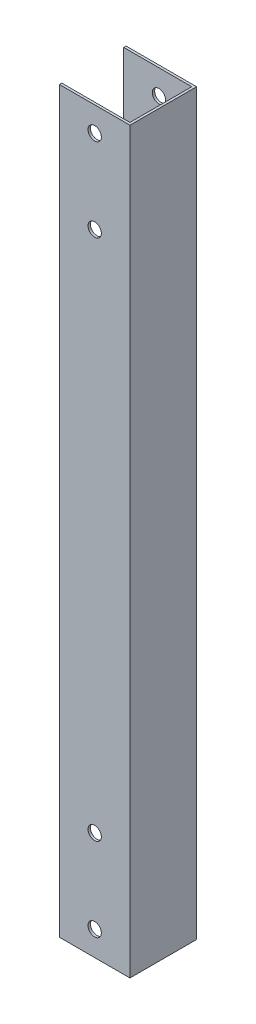
ISO-10303-21;
HEADER;
FILE_DESCRIPTION(('STEP AP214'),'2;1');
FILE_NAME('part.step','',(''),(''),'','','');
FILE_SCHEMA(('AUTOMOTIVE_DESIGN { 1 0 10303 214 1 1 1 1 }'));
ENDSEC;
DATA;
#1=APPLICATION_CONTEXT('core data for automotive mechanical design processes');
#2=APPLICATION_PROTOCOL_DEFINITION('international standard','automotive_design',2000,#1);
#3=PRODUCT_CONTEXT('',#1,'mechanical');
#4=PRODUCT('Part','Part','',(#3));
#5=PRODUCT_RELATED_PRODUCT_CATEGORY('part','',(#4));
#6=PRODUCT_DEFINITION_FORMATION('','',#4);
#7=PRODUCT_DEFINITION_CONTEXT('part definition',#1,'design');
#8=PRODUCT_DEFINITION('design','',#6,#7);
#9=PRODUCT_DEFINITION_SHAPE('','',#8);
#10=(LENGTH_UNIT() NAMED_UNIT(*) SI_UNIT(.MILLI.,.METRE.));
#11=(NAMED_UNIT(*) PLANE_ANGLE_UNIT() SI_UNIT($,.RADIAN.));
#12=(NAMED_UNIT(*) SI_UNIT($,.STERADIAN.) SOLID_ANGLE_UNIT());
#13=UNCERTAINTY_MEASURE_WITH_UNIT(LENGTH_MEASURE(1.E-05),#10,'distance_accuracy_value','');
#14=(GEOMETRIC_REPRESENTATION_CONTEXT(3) GLOBAL_UNCERTAINTY_ASSIGNED_CONTEXT((#13)) GLOBAL_UNIT_ASSIGNED_CONTEXT((#10,
#11,#12)) REPRESENTATION_CONTEXT('',''));
#15=CARTESIAN_POINT('',(0.,0.,0.));
#16=DIRECTION('',(0.,0.,1.));
#17=DIRECTION('',(1.,0.,0.));
#18=AXIS2_PLACEMENT_3D('',#15,#16,#17);
#19=CARTESIAN_POINT('',(-12.7,-133.,-12.));
#20=DIRECTION('',(-1.,0.,0.));
#21=DIRECTION('',(0.,0.,1.));
#22=AXIS2_PLACEMENT_3D('',#19,#20,#21);
#23=PLANE('',#22);
#24=DIRECTION('',(0.,0.,1.));
#25=VECTOR('',#24,1.);
#26=CARTESIAN_POINT('',(-12.7,133.,-12.));
#27=LINE('',#26,#25);
#28=CARTESIAN_POINT('',(-12.7,133.,11.14));
#29=VERTEX_POINT('',#28);
#30=CARTESIAN_POINT('',(-12.7,133.,12.));
#31=VERTEX_POINT('',#30);
#32=EDGE_CURVE('E135',#29,#31,#27,.T.);
#33=ORIENTED_EDGE('',*,*,#32,.F.);
#34=DIRECTION('',(0.,-1.,0.));
#35=VECTOR('',#34,1.);
#36=CARTESIAN_POINT('',(-12.7,-133.,11.14));
#37=LINE('',#36,#35);
#38=CARTESIAN_POINT('',(-12.7,-133.,11.14));
#39=VERTEX_POINT('',#38);
#40=EDGE_CURVE('E122',#29,#39,#37,.T.);
#41=ORIENTED_EDGE('',*,*,#40,.T.);
#42=DIRECTION('',(0.,0.,1.));
#43=VECTOR('',#42,1.);
#44=CARTESIAN_POINT('',(-12.7,-133.,-12.));
#45=LINE('',#44,#43);
#46=CARTESIAN_POINT('',(-12.7,-133.,12.));
#47=VERTEX_POINT('',#46);
#48=EDGE_CURVE('E147',#39,#47,#45,.T.);
#49=ORIENTED_EDGE('',*,*,#48,.T.);
#50=DIRECTION('',(0.,1.,0.));
#51=VECTOR('',#50,1.);
#52=CARTESIAN_POINT('',(-12.7,-133.,12.));
#53=LINE('',#52,#51);
#54=EDGE_CURVE('E156',#47,#31,#53,.T.);
#55=ORIENTED_EDGE('',*,*,#54,.T.);
#56=EDGE_LOOP('',(#33,#41,#49,#55));
#57=FACE_BOUND('',#56,.T.);
#58=ADVANCED_FACE('F33',(#57),#23,.T.);
#59=CARTESIAN_POINT('',(-12.7,-133.,-12.));
#60=VERTEX_POINT('',#59);
#61=CARTESIAN_POINT('',(-12.7,-133.,-11.14));
#62=VERTEX_POINT('',#61);
#63=EDGE_CURVE('E148',#60,#62,#45,.T.);
#64=ORIENTED_EDGE('',*,*,#63,.T.);
#65=DIRECTION('',(0.,1.,0.));
#66=VECTOR('',#65,1.);
#67=CARTESIAN_POINT('',(-12.7,-133.,-11.14));
#68=LINE('',#67,#66);
#69=CARTESIAN_POINT('',(-12.7,133.,-11.14));
#70=VERTEX_POINT('',#69);
#71=EDGE_CURVE('E102',#62,#70,#68,.T.);
#72=ORIENTED_EDGE('',*,*,#71,.T.);
#73=CARTESIAN_POINT('',(-12.7,133.,-12.));
#74=VERTEX_POINT('',#73);
#75=EDGE_CURVE('E136',#74,#70,#27,.T.);
#76=ORIENTED_EDGE('',*,*,#75,.F.);
#77=DIRECTION('',(0.,1.,0.));
#78=VECTOR('',#77,1.);
#79=CARTESIAN_POINT('',(-12.7,-133.,-12.));
#80=LINE('',#79,#78);
#81=EDGE_CURVE('E159',#60,#74,#80,.T.);
#82=ORIENTED_EDGE('',*,*,#81,.F.);
#83=EDGE_LOOP('',(#64,#72,#76,#82));
#84=FACE_BOUND('',#83,.T.);
#85=ADVANCED_FACE('F205',(#84),#23,.T.);
#86=CARTESIAN_POINT('',(0.,-133.,0.));
#87=DIRECTION('',(0.,1.,0.));
#88=DIRECTION('',(0.,0.,1.));
#89=AXIS2_PLACEMENT_3D('',#86,#87,#88);
#90=PLANE('',#89);
#91=DIRECTION('',(-1.,0.,0.));
#92=VECTOR('',#91,1.);
#93=CARTESIAN_POINT('',(0.,-133.,11.14));
#94=LINE('',#93,#92);
#95=CARTESIAN_POINT('',(11.84,-133.,11.14));
#96=VERTEX_POINT('',#95);
#97=EDGE_CURVE('E121',#96,#39,#94,.T.);
#98=ORIENTED_EDGE('',*,*,#97,.F.);
#99=DIRECTION('',(0.,0.,1.));
#100=VECTOR('',#99,1.);
#101=CARTESIAN_POINT('',(11.84,-133.,0.));
#102=LINE('',#101,#100);
#103=CARTESIAN_POINT('',(11.84,-133.,-11.14));
#104=VERTEX_POINT('',#103);
#105=EDGE_CURVE('E107',#104,#96,#102,.T.);
#106=ORIENTED_EDGE('',*,*,#105,.F.);
#107=DIRECTION('',(1.,0.,0.));
#108=VECTOR('',#107,1.);
#109=CARTESIAN_POINT('',(0.,-133.,-11.14));
#110=LINE('',#109,#108);
#111=EDGE_CURVE('E99',#62,#104,#110,.T.);
#112=ORIENTED_EDGE('',*,*,#111,.F.);
#113=ORIENTED_EDGE('',*,*,#63,.F.);
#114=DIRECTION('',(-1.,0.,0.));
#115=VECTOR('',#114,1.);
#116=CARTESIAN_POINT('',(-12.7,-133.,-12.));
#117=LINE('',#116,#115);
#118=CARTESIAN_POINT('',(12.7,-133.,-12.));
#119=VERTEX_POINT('',#118);
#120=EDGE_CURVE('E144',#119,#60,#117,.T.);
#121=ORIENTED_EDGE('',*,*,#120,.F.);
#122=DIRECTION('',(0.,0.,-1.));
#123=VECTOR('',#122,1.);
#124=CARTESIAN_POINT('',(12.7,-133.,-12.));
#125=LINE('',#124,#123);
#126=CARTESIAN_POINT('',(12.7,-133.,12.));
#127=VERTEX_POINT('',#126);
#128=EDGE_CURVE('E142',#127,#119,#125,.T.);
#129=ORIENTED_EDGE('',*,*,#128,.F.);
#130=DIRECTION('',(1.,0.,0.));
#131=VECTOR('',#130,1.);
#132=CARTESIAN_POINT('',(-12.7,-133.,12.));
#133=LINE('',#132,#131);
#134=EDGE_CURVE('E150',#47,#127,#133,.T.);
#135=ORIENTED_EDGE('',*,*,#134,.F.);
#136=ORIENTED_EDGE('',*,*,#48,.F.);
#137=EDGE_LOOP('',(#98,#106,#112,#113,#121,#129,#135,#136));
#138=FACE_BOUND('',#137,.T.);
#139=ADVANCED_FACE('F119',(#138),#90,.F.);
#140=CARTESIAN_POINT('',(0.,133.,0.));
#141=DIRECTION('',(0.,1.,0.));
#142=DIRECTION('',(0.,0.,1.));
#143=AXIS2_PLACEMENT_3D('',#140,#141,#142);
#144=PLANE('',#143);
#145=DIRECTION('',(0.,0.,1.));
#146=VECTOR('',#145,1.);
#147=CARTESIAN_POINT('',(11.84,133.,0.));
#148=LINE('',#147,#146);
#149=CARTESIAN_POINT('',(11.84,133.,-11.14));
#150=VERTEX_POINT('',#149);
#151=CARTESIAN_POINT('',(11.84,133.,11.14));
#152=VERTEX_POINT('',#151);
#153=EDGE_CURVE('E42',#150,#152,#148,.T.);
#154=ORIENTED_EDGE('',*,*,#153,.T.);
#155=DIRECTION('',(-1.,0.,0.));
#156=VECTOR('',#155,1.);
#157=CARTESIAN_POINT('',(0.,133.,11.14));
#158=LINE('',#157,#156);
#159=EDGE_CURVE('E11',#152,#29,#158,.T.);
#160=ORIENTED_EDGE('',*,*,#159,.T.);
#161=ORIENTED_EDGE('',*,*,#32,.T.);
#162=DIRECTION('',(1.,0.,0.));
#163=VECTOR('',#162,1.);
#164=CARTESIAN_POINT('',(-12.7,133.,12.));
#165=LINE('',#164,#163);
#166=CARTESIAN_POINT('',(12.7,133.,12.));
#167=VERTEX_POINT('',#166);
#168=EDGE_CURVE('E139',#31,#167,#165,.T.);
#169=ORIENTED_EDGE('',*,*,#168,.T.);
#170=DIRECTION('',(0.,0.,-1.));
#171=VECTOR('',#170,1.);
#172=CARTESIAN_POINT('',(12.7,133.,-12.));
#173=LINE('',#172,#171);
#174=CARTESIAN_POINT('',(12.7,133.,-12.));
#175=VERTEX_POINT('',#174);
#176=EDGE_CURVE('E129',#167,#175,#173,.T.);
#177=ORIENTED_EDGE('',*,*,#176,.T.);
#178=DIRECTION('',(-1.,0.,0.));
#179=VECTOR('',#178,1.);
#180=CARTESIAN_POINT('',(-12.7,133.,-12.));
#181=LINE('',#180,#179);
#182=EDGE_CURVE('E132',#175,#74,#181,.T.);
#183=ORIENTED_EDGE('',*,*,#182,.T.);
#184=ORIENTED_EDGE('',*,*,#75,.T.);
#185=DIRECTION('',(1.,0.,0.));
#186=VECTOR('',#185,1.);
#187=CARTESIAN_POINT('',(0.,133.,-11.14));
#188=LINE('',#187,#186);
#189=EDGE_CURVE('E155',#70,#150,#188,.T.);
#190=ORIENTED_EDGE('',*,*,#189,.T.);
#191=EDGE_LOOP('',(#154,#160,#161,#169,#177,#183,#184,#190));
#192=FACE_BOUND('',#191,.T.);
#193=ADVANCED_FACE('F207',(#192),#144,.T.);
#194=CARTESIAN_POINT('',(12.7,-133.,-12.));
#195=DIRECTION('',(1.,0.,0.));
#196=DIRECTION('',(0.,0.,-1.));
#197=AXIS2_PLACEMENT_3D('',#194,#195,#196);
#198=PLANE('',#197);
#199=DIRECTION('',(0.,1.,0.));
#200=VECTOR('',#199,1.);
#201=CARTESIAN_POINT('',(12.7,-133.,-12.));
#202=LINE('',#201,#200);
#203=EDGE_CURVE('E153',#119,#175,#202,.T.);
#204=ORIENTED_EDGE('',*,*,#203,.T.);
#205=ORIENTED_EDGE('',*,*,#176,.F.);
#206=DIRECTION('',(0.,1.,0.));
#207=VECTOR('',#206,1.);
#208=CARTESIAN_POINT('',(12.7,-133.,12.));
#209=LINE('',#208,#207);
#210=EDGE_CURVE('E58',#127,#167,#209,.T.);
#211=ORIENTED_EDGE('',*,*,#210,.F.);
#212=ORIENTED_EDGE('',*,*,#128,.T.);
#213=EDGE_LOOP('',(#204,#205,#211,#212));
#214=FACE_BOUND('',#213,.T.);
#215=ADVANCED_FACE('F35',(#214),#198,.T.);
#216=CARTESIAN_POINT('',(-12.7,-133.,12.));
#217=DIRECTION('',(0.,0.,1.));
#218=DIRECTION('',(1.,0.,0.));
#219=AXIS2_PLACEMENT_3D('',#216,#217,#218);
#220=PLANE('',#219);
#221=CARTESIAN_POINT('',(0.,124.125,12.));
#222=DIRECTION('',(0.,0.,1.));
#223=DIRECTION('',(1.,0.,0.));
#224=AXIS2_PLACEMENT_3D('',#221,#222,#223);
#225=CIRCLE('',#224,2.4);
#226=CARTESIAN_POINT('',(2.40000000000003,124.125,12.));
#227=VERTEX_POINT('',#226);
#228=EDGE_CURVE('E116',#227,#227,#225,.F.);
#229=ORIENTED_EDGE('',*,*,#228,.T.);
#230=EDGE_LOOP('',(#229));
#231=FACE_BOUND('',#230,.T.);
#232=CARTESIAN_POINT('',(0.,-94.125,12.));
#233=DIRECTION('',(0.,0.,1.));
#234=DIRECTION('',(1.,0.,0.));
#235=AXIS2_PLACEMENT_3D('',#232,#233,#234);
#236=CIRCLE('',#235,2.4);
#237=CARTESIAN_POINT('',(2.40000000000003,-94.125,12.));
#238=VERTEX_POINT('',#237);
#239=EDGE_CURVE('E192',#238,#238,#236,.F.);
#240=ORIENTED_EDGE('',*,*,#239,.T.);
#241=EDGE_LOOP('',(#240));
#242=FACE_BOUND('',#241,.T.);
#243=CARTESIAN_POINT('',(0.,-124.125,12.));
#244=DIRECTION('',(0.,0.,1.));
#245=DIRECTION('',(1.,0.,0.));
#246=AXIS2_PLACEMENT_3D('',#243,#244,#245);
#247=CIRCLE('',#246,2.4);
#248=CARTESIAN_POINT('',(2.40000000000003,-124.125,12.));
#249=VERTEX_POINT('',#248);
#250=EDGE_CURVE('E175',#249,#249,#247,.F.);
#251=ORIENTED_EDGE('',*,*,#250,.T.);
#252=EDGE_LOOP('',(#251));
#253=FACE_BOUND('',#252,.T.);
#254=CARTESIAN_POINT('',(0.,94.125,12.));
#255=DIRECTION('',(0.,0.,1.));
#256=DIRECTION('',(1.,0.,0.));
#257=AXIS2_PLACEMENT_3D('',#254,#255,#256);
#258=CIRCLE('',#257,2.4);
#259=CARTESIAN_POINT('',(2.4,94.125,12.));
#260=VERTEX_POINT('',#259);
#261=EDGE_CURVE('E171',#260,#260,#258,.F.);
#262=ORIENTED_EDGE('',*,*,#261,.T.);
#263=EDGE_LOOP('',(#262));
#264=FACE_BOUND('',#263,.T.);
#265=ORIENTED_EDGE('',*,*,#210,.T.);
#266=ORIENTED_EDGE('',*,*,#168,.F.);
#267=ORIENTED_EDGE('',*,*,#54,.F.);
#268=ORIENTED_EDGE('',*,*,#134,.T.);
#269=EDGE_LOOP('',(#265,#266,#267,#268));
#270=FACE_BOUND('',#269,.T.);
#271=ADVANCED_FACE('F214',(#231,#242,#253,#264,#270),#220,.T.);
#272=CARTESIAN_POINT('',(-12.7,-133.,-12.));
#273=DIRECTION('',(0.,0.,-1.));
#274=DIRECTION('',(-1.,0.,0.));
#275=AXIS2_PLACEMENT_3D('',#272,#273,#274);
#276=PLANE('',#275);
#277=CARTESIAN_POINT('',(0.,124.125,-12.));
#278=DIRECTION('',(0.,0.,-1.));
#279=DIRECTION('',(-1.,0.,0.));
#280=AXIS2_PLACEMENT_3D('',#277,#278,#279);
#281=CIRCLE('',#280,2.4);
#282=CARTESIAN_POINT('',(-2.39999999999997,124.125,-12.));
#283=VERTEX_POINT('',#282);
#284=EDGE_CURVE('E198',#283,#283,#281,.F.);
#285=ORIENTED_EDGE('',*,*,#284,.T.);
#286=EDGE_LOOP('',(#285));
#287=FACE_BOUND('',#286,.T.);
#288=CARTESIAN_POINT('',(0.,-94.125,-12.));
#289=DIRECTION('',(0.,0.,-1.));
#290=DIRECTION('',(-1.,0.,0.));
#291=AXIS2_PLACEMENT_3D('',#288,#289,#290);
#292=CIRCLE('',#291,2.4);
#293=CARTESIAN_POINT('',(-2.39999999999997,-94.125,-12.));
#294=VERTEX_POINT('',#293);
#295=EDGE_CURVE('E179',#294,#294,#292,.F.);
#296=ORIENTED_EDGE('',*,*,#295,.T.);
#297=EDGE_LOOP('',(#296));
#298=FACE_BOUND('',#297,.T.);
#299=CARTESIAN_POINT('',(0.,-124.125,-12.));
#300=DIRECTION('',(0.,0.,-1.));
#301=DIRECTION('',(-1.,0.,0.));
#302=AXIS2_PLACEMENT_3D('',#299,#300,#301);
#303=CIRCLE('',#302,2.4);
#304=CARTESIAN_POINT('',(-2.39999999999997,-124.125,-12.));
#305=VERTEX_POINT('',#304);
#306=EDGE_CURVE('E182',#305,#305,#303,.F.);
#307=ORIENTED_EDGE('',*,*,#306,.T.);
#308=EDGE_LOOP('',(#307));
#309=FACE_BOUND('',#308,.T.);
#310=CARTESIAN_POINT('',(0.,94.125,-12.));
#311=DIRECTION('',(0.,0.,-1.));
#312=DIRECTION('',(-1.,0.,0.));
#313=AXIS2_PLACEMENT_3D('',#310,#311,#312);
#314=CIRCLE('',#313,2.4);
#315=CARTESIAN_POINT('',(-2.4,94.125,-12.));
#316=VERTEX_POINT('',#315);
#317=EDGE_CURVE('E246',#316,#316,#314,.F.);
#318=ORIENTED_EDGE('',*,*,#317,.T.);
#319=EDGE_LOOP('',(#318));
#320=FACE_BOUND('',#319,.T.);
#321=ORIENTED_EDGE('',*,*,#81,.T.);
#322=ORIENTED_EDGE('',*,*,#182,.F.);
#323=ORIENTED_EDGE('',*,*,#203,.F.);
#324=ORIENTED_EDGE('',*,*,#120,.T.);
#325=EDGE_LOOP('',(#321,#322,#323,#324));
#326=FACE_BOUND('',#325,.T.);
#327=ADVANCED_FACE('F210',(#287,#298,#309,#320,#326),#276,.T.);
#328=CARTESIAN_POINT('',(11.84,150.,11.14));
#329=DIRECTION('',(0.,0.,-1.));
#330=DIRECTION('',(-1.,0.,0.));
#331=AXIS2_PLACEMENT_3D('',#328,#329,#330);
#332=PLANE('',#331);
#333=CARTESIAN_POINT('',(0.,124.125,11.14));
#334=DIRECTION('',(0.,0.,-1.));
#335=DIRECTION('',(-1.,0.,0.));
#336=AXIS2_PLACEMENT_3D('',#333,#334,#335);
#337=CIRCLE('',#336,2.4);
#338=CARTESIAN_POINT('',(-2.39999999999997,124.125,11.14));
#339=VERTEX_POINT('',#338);
#340=EDGE_CURVE('E195',#339,#339,#337,.F.);
#341=ORIENTED_EDGE('',*,*,#340,.T.);
#342=EDGE_LOOP('',(#341));
#343=FACE_BOUND('',#342,.T.);
#344=CARTESIAN_POINT('',(0.,-94.125,11.14));
#345=DIRECTION('',(0.,0.,-1.));
#346=DIRECTION('',(-1.,0.,0.));
#347=AXIS2_PLACEMENT_3D('',#344,#345,#346);
#348=CIRCLE('',#347,2.4);
#349=CARTESIAN_POINT('',(-2.39999999999997,-94.125,11.14));
#350=VERTEX_POINT('',#349);
#351=EDGE_CURVE('E174',#350,#350,#348,.F.);
#352=ORIENTED_EDGE('',*,*,#351,.T.);
#353=EDGE_LOOP('',(#352));
#354=FACE_BOUND('',#353,.T.);
#355=CARTESIAN_POINT('',(0.,-124.125,11.14));
#356=DIRECTION('',(0.,0.,-1.));
#357=DIRECTION('',(-1.,0.,0.));
#358=AXIS2_PLACEMENT_3D('',#355,#356,#357);
#359=CIRCLE('',#358,2.4);
#360=CARTESIAN_POINT('',(-2.39999999999997,-124.125,11.14));
#361=VERTEX_POINT('',#360);
#362=EDGE_CURVE('E170',#361,#361,#359,.F.);
#363=ORIENTED_EDGE('',*,*,#362,.T.);
#364=EDGE_LOOP('',(#363));
#365=FACE_BOUND('',#364,.T.);
#366=CARTESIAN_POINT('',(0.,94.125,11.14));
#367=DIRECTION('',(0.,0.,-1.));
#368=DIRECTION('',(-1.,0.,0.));
#369=AXIS2_PLACEMENT_3D('',#366,#367,#368);
#370=CIRCLE('',#369,2.4);
#371=CARTESIAN_POINT('',(-2.4,94.125,11.14));
#372=VERTEX_POINT('',#371);
#373=EDGE_CURVE('E167',#372,#372,#370,.F.);
#374=ORIENTED_EDGE('',*,*,#373,.T.);
#375=EDGE_LOOP('',(#374));
#376=FACE_BOUND('',#375,.T.);
#377=ORIENTED_EDGE('',*,*,#97,.T.);
#378=ORIENTED_EDGE('',*,*,#40,.F.);
#379=ORIENTED_EDGE('',*,*,#159,.F.);
#380=DIRECTION('',(0.,-1.,0.));
#381=VECTOR('',#380,1.);
#382=CARTESIAN_POINT('',(11.84,150.,11.14));
#383=LINE('',#382,#381);
#384=EDGE_CURVE('E115',#152,#96,#383,.T.);
#385=ORIENTED_EDGE('',*,*,#384,.T.);
#386=EDGE_LOOP('',(#377,#378,#379,#385));
#387=FACE_BOUND('',#386,.T.);
#388=ADVANCED_FACE('F231',(#343,#354,#365,#376,#387),#332,.T.);
#389=CARTESIAN_POINT('',(11.84,150.,-11.14));
#390=DIRECTION('',(-1.,0.,0.));
#391=DIRECTION('',(0.,0.,1.));
#392=AXIS2_PLACEMENT_3D('',#389,#390,#391);
#393=PLANE('',#392);
#394=ORIENTED_EDGE('',*,*,#105,.T.);
#395=ORIENTED_EDGE('',*,*,#384,.F.);
#396=ORIENTED_EDGE('',*,*,#153,.F.);
#397=DIRECTION('',(0.,-1.,0.));
#398=VECTOR('',#397,1.);
#399=CARTESIAN_POINT('',(11.84,150.,-11.14));
#400=LINE('',#399,#398);
#401=EDGE_CURVE('E50',#150,#104,#400,.T.);
#402=ORIENTED_EDGE('',*,*,#401,.T.);
#403=EDGE_LOOP('',(#394,#395,#396,#402));
#404=FACE_BOUND('',#403,.T.);
#405=ADVANCED_FACE('F110',(#404),#393,.T.);
#406=CARTESIAN_POINT('',(-14.16,150.,-11.14));
#407=DIRECTION('',(0.,0.,1.));
#408=DIRECTION('',(1.,0.,0.));
#409=AXIS2_PLACEMENT_3D('',#406,#407,#408);
#410=PLANE('',#409);
#411=CARTESIAN_POINT('',(0.,124.125,-11.14));
#412=DIRECTION('',(0.,0.,1.));
#413=DIRECTION('',(1.,0.,0.));
#414=AXIS2_PLACEMENT_3D('',#411,#412,#413);
#415=CIRCLE('',#414,2.4);
#416=CARTESIAN_POINT('',(2.40000000000003,124.125,-11.14));
#417=VERTEX_POINT('',#416);
#418=EDGE_CURVE('E37',#417,#417,#415,.F.);
#419=ORIENTED_EDGE('',*,*,#418,.T.);
#420=EDGE_LOOP('',(#419));
#421=FACE_BOUND('',#420,.T.);
#422=CARTESIAN_POINT('',(0.,-94.125,-11.14));
#423=DIRECTION('',(0.,0.,1.));
#424=DIRECTION('',(1.,0.,0.));
#425=AXIS2_PLACEMENT_3D('',#422,#423,#424);
#426=CIRCLE('',#425,2.4);
#427=CARTESIAN_POINT('',(2.40000000000003,-94.125,-11.14));
#428=VERTEX_POINT('',#427);
#429=EDGE_CURVE('E172',#428,#428,#426,.F.);
#430=ORIENTED_EDGE('',*,*,#429,.T.);
#431=EDGE_LOOP('',(#430));
#432=FACE_BOUND('',#431,.T.);
#433=CARTESIAN_POINT('',(0.,-124.125,-11.14));
#434=DIRECTION('',(0.,0.,1.));
#435=DIRECTION('',(1.,0.,0.));
#436=AXIS2_PLACEMENT_3D('',#433,#434,#435);
#437=CIRCLE('',#436,2.4);
#438=CARTESIAN_POINT('',(2.40000000000003,-124.125,-11.14));
#439=VERTEX_POINT('',#438);
#440=EDGE_CURVE('E168',#439,#439,#437,.F.);
#441=ORIENTED_EDGE('',*,*,#440,.T.);
#442=EDGE_LOOP('',(#441));
#443=FACE_BOUND('',#442,.T.);
#444=CARTESIAN_POINT('',(0.,94.125,-11.14));
#445=DIRECTION('',(0.,0.,1.));
#446=DIRECTION('',(1.,0.,0.));
#447=AXIS2_PLACEMENT_3D('',#444,#445,#446);
#448=CIRCLE('',#447,2.4);
#449=CARTESIAN_POINT('',(2.4,94.125,-11.14));
#450=VERTEX_POINT('',#449);
#451=EDGE_CURVE('E164',#450,#450,#448,.F.);
#452=ORIENTED_EDGE('',*,*,#451,.T.);
#453=EDGE_LOOP('',(#452));
#454=FACE_BOUND('',#453,.T.);
#455=ORIENTED_EDGE('',*,*,#111,.T.);
#456=ORIENTED_EDGE('',*,*,#401,.F.);
#457=ORIENTED_EDGE('',*,*,#189,.F.);
#458=ORIENTED_EDGE('',*,*,#71,.F.);
#459=EDGE_LOOP('',(#455,#456,#457,#458));
#460=FACE_BOUND('',#459,.T.);
#461=ADVANCED_FACE('F100',(#421,#432,#443,#454,#460),#410,.T.);
#462=CARTESIAN_POINT('',(0.,94.125,150.));
#463=DIRECTION('',(0.,0.,-1.));
#464=DIRECTION('',(-1.,0.,0.));
#465=AXIS2_PLACEMENT_3D('',#462,#463,#464);
#466=CYLINDRICAL_SURFACE('',#465,2.4);
#467=ORIENTED_EDGE('',*,*,#317,.F.);
#468=EDGE_LOOP('',(#467));
#469=FACE_BOUND('',#468,.T.);
#470=ORIENTED_EDGE('',*,*,#451,.F.);
#471=EDGE_LOOP('',(#470));
#472=FACE_BOUND('',#471,.T.);
#473=ADVANCED_FACE('F276',(#469,#472),#466,.F.);
#474=CARTESIAN_POINT('',(0.,-124.125,150.));
#475=DIRECTION('',(0.,0.,-1.));
#476=DIRECTION('',(-1.,0.,0.));
#477=AXIS2_PLACEMENT_3D('',#474,#475,#476);
#478=CYLINDRICAL_SURFACE('',#477,2.4);
#479=ORIENTED_EDGE('',*,*,#306,.F.);
#480=EDGE_LOOP('',(#479));
#481=FACE_BOUND('',#480,.T.);
#482=ORIENTED_EDGE('',*,*,#440,.F.);
#483=EDGE_LOOP('',(#482));
#484=FACE_BOUND('',#483,.T.);
#485=ADVANCED_FACE('F264',(#481,#484),#478,.F.);
#486=CARTESIAN_POINT('',(0.,-94.125,150.));
#487=DIRECTION('',(0.,0.,-1.));
#488=DIRECTION('',(-1.,0.,0.));
#489=AXIS2_PLACEMENT_3D('',#486,#487,#488);
#490=CYLINDRICAL_SURFACE('',#489,2.4);
#491=ORIENTED_EDGE('',*,*,#295,.F.);
#492=EDGE_LOOP('',(#491));
#493=FACE_BOUND('',#492,.T.);
#494=ORIENTED_EDGE('',*,*,#429,.F.);
#495=EDGE_LOOP('',(#494));
#496=FACE_BOUND('',#495,.T.);
#497=ADVANCED_FACE('F272',(#493,#496),#490,.F.);
#498=CARTESIAN_POINT('',(0.,124.125,150.));
#499=DIRECTION('',(0.,0.,-1.));
#500=DIRECTION('',(-1.,0.,0.));
#501=AXIS2_PLACEMENT_3D('',#498,#499,#500);
#502=CYLINDRICAL_SURFACE('',#501,2.4);
#503=ORIENTED_EDGE('',*,*,#284,.F.);
#504=EDGE_LOOP('',(#503));
#505=FACE_BOUND('',#504,.T.);
#506=ORIENTED_EDGE('',*,*,#418,.F.);
#507=EDGE_LOOP('',(#506));
#508=FACE_BOUND('',#507,.T.);
#509=ADVANCED_FACE('F273',(#505,#508),#502,.F.);
#510=ORIENTED_EDGE('',*,*,#261,.F.);
#511=EDGE_LOOP('',(#510));
#512=FACE_BOUND('',#511,.T.);
#513=ORIENTED_EDGE('',*,*,#373,.F.);
#514=EDGE_LOOP('',(#513));
#515=FACE_BOUND('',#514,.T.);
#516=ADVANCED_FACE('F261',(#512,#515),#466,.F.);
#517=ORIENTED_EDGE('',*,*,#250,.F.);
#518=EDGE_LOOP('',(#517));
#519=FACE_BOUND('',#518,.T.);
#520=ORIENTED_EDGE('',*,*,#362,.F.);
#521=EDGE_LOOP('',(#520));
#522=FACE_BOUND('',#521,.T.);
#523=ADVANCED_FACE('F258',(#519,#522),#478,.F.);
#524=ORIENTED_EDGE('',*,*,#239,.F.);
#525=EDGE_LOOP('',(#524));
#526=FACE_BOUND('',#525,.T.);
#527=ORIENTED_EDGE('',*,*,#351,.F.);
#528=EDGE_LOOP('',(#527));
#529=FACE_BOUND('',#528,.T.);
#530=ADVANCED_FACE('F260',(#526,#529),#490,.F.);
#531=ORIENTED_EDGE('',*,*,#228,.F.);
#532=EDGE_LOOP('',(#531));
#533=FACE_BOUND('',#532,.T.);
#534=ORIENTED_EDGE('',*,*,#340,.F.);
#535=EDGE_LOOP('',(#534));
#536=FACE_BOUND('',#535,.T.);
#537=ADVANCED_FACE('F269',(#533,#536),#502,.F.);
#538=CLOSED_SHELL('',(#58,#85,#139,#193,#215,#271,#327,#388,#405,#461,#473,#485,#497,#509,#516,
#523,#530,#537));
#539=MANIFOLD_SOLID_BREP('B2',#538);
#540=ADVANCED_BREP_SHAPE_REPRESENTATION('',(#18,#539),#14);
#541=SHAPE_DEFINITION_REPRESENTATION(#9,#540);
ENDSEC;
END-ISO-10303-21;
